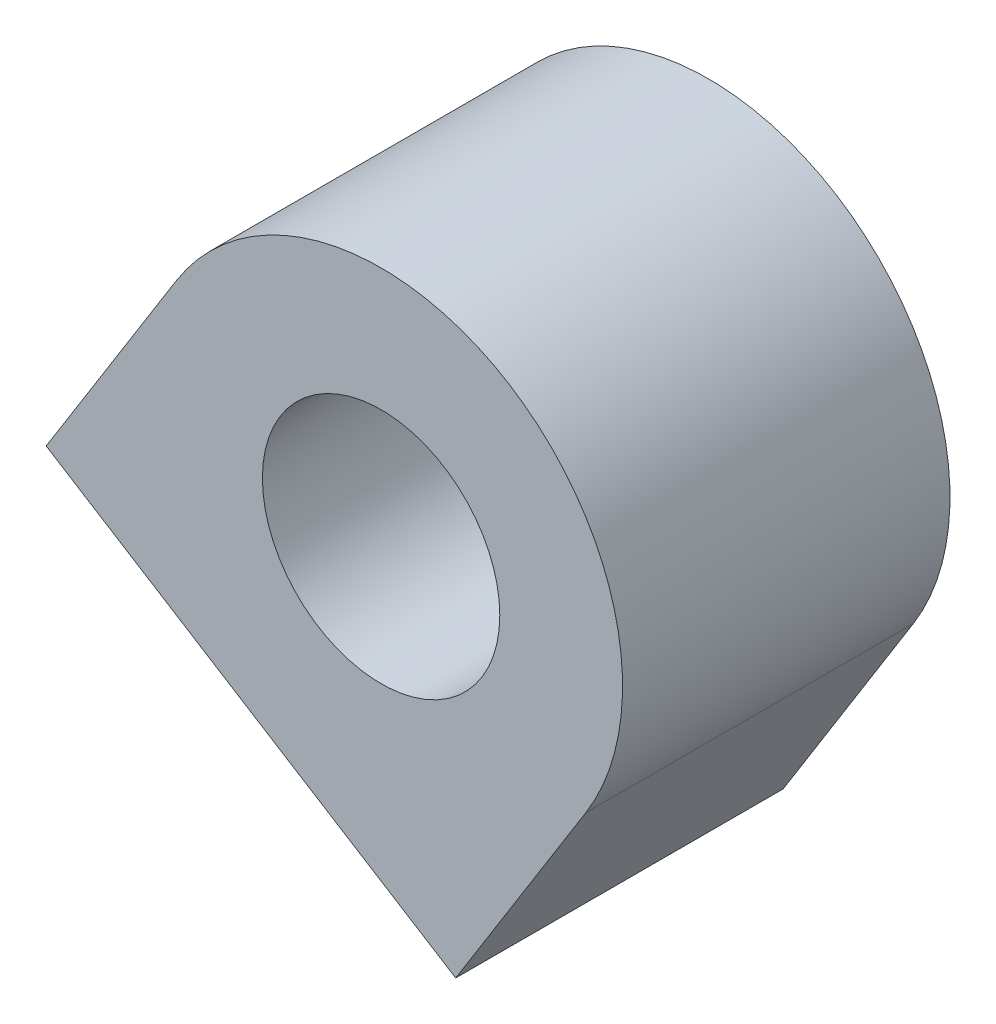
ISO-10303-21;
HEADER;
FILE_DESCRIPTION(('STEP AP214'),'2;1');
FILE_NAME('part.step','',(''),(''),'','','');
FILE_SCHEMA(('AUTOMOTIVE_DESIGN { 1 0 10303 214 1 1 1 1 }'));
ENDSEC;
DATA;
#1=APPLICATION_CONTEXT('core data for automotive mechanical design processes');
#2=APPLICATION_PROTOCOL_DEFINITION('international standard','automotive_design',2000,#1);
#3=PRODUCT_CONTEXT('',#1,'mechanical');
#4=PRODUCT('Part','Part','',(#3));
#5=PRODUCT_RELATED_PRODUCT_CATEGORY('part','',(#4));
#6=PRODUCT_DEFINITION_FORMATION('','',#4);
#7=PRODUCT_DEFINITION_CONTEXT('part definition',#1,'design');
#8=PRODUCT_DEFINITION('design','',#6,#7);
#9=PRODUCT_DEFINITION_SHAPE('','',#8);
#10=(LENGTH_UNIT() NAMED_UNIT(*) SI_UNIT(.MILLI.,.METRE.));
#11=(NAMED_UNIT(*) PLANE_ANGLE_UNIT() SI_UNIT($,.RADIAN.));
#12=(NAMED_UNIT(*) SI_UNIT($,.STERADIAN.) SOLID_ANGLE_UNIT());
#13=UNCERTAINTY_MEASURE_WITH_UNIT(LENGTH_MEASURE(1.E-05),#10,'distance_accuracy_value','');
#14=(GEOMETRIC_REPRESENTATION_CONTEXT(3) GLOBAL_UNCERTAINTY_ASSIGNED_CONTEXT((#13)) GLOBAL_UNIT_ASSIGNED_CONTEXT((#10,
#11,#12)) REPRESENTATION_CONTEXT('',''));
#15=CARTESIAN_POINT('',(0.,0.,0.));
#16=DIRECTION('',(0.,0.,1.));
#17=DIRECTION('',(1.,0.,0.));
#18=AXIS2_PLACEMENT_3D('',#15,#16,#17);
#19=CARTESIAN_POINT('',(0.,0.,5.));
#20=DIRECTION('',(0.,0.,-1.));
#21=DIRECTION('',(-1.,0.,0.));
#22=AXIS2_PLACEMENT_3D('',#19,#20,#21);
#23=PLANE('',#22);
#24=CARTESIAN_POINT('',(-58.1017203304311,-13.2762736974744,5.));
#25=DIRECTION('',(0.,0.,-1.));
#26=DIRECTION('',(-1.,0.,0.));
#27=AXIS2_PLACEMENT_3D('',#24,#25,#26);
#28=CIRCLE('',#27,1.45);
#29=CARTESIAN_POINT('',(-59.5517203304311,-13.2762736974744,5.));
#30=VERTEX_POINT('',#29);
#31=EDGE_CURVE('E89',#30,#30,#28,.T.);
#32=ORIENTED_EDGE('',*,*,#31,.T.);
#33=EDGE_LOOP('',(#32));
#34=FACE_BOUND('',#33,.T.);
#35=DIRECTION('',(-0.52999894000318,-0.847998304005088,0.));
#36=VECTOR('',#35,1.);
#37=CARTESIAN_POINT('',(-38.3157427861253,23.9473392413283,5.));
#38=LINE('',#37,#36);
#39=CARTESIAN_POINT('',(-60.6033153272461,-11.712776824465,5.));
#40=VERTEX_POINT('',#39);
#41=CARTESIAN_POINT('',(-62.1933121472557,-14.2567717364803,5.00000000000001));
#42=VERTEX_POINT('',#41);
#43=EDGE_CURVE('E44',#40,#42,#38,.T.);
#44=ORIENTED_EDGE('',*,*,#43,.T.);
#45=DIRECTION('',(-0.847998304005088,0.52999894000318,0.));
#46=VECTOR('',#45,1.);
#47=CARTESIAN_POINT('',(-23.8775693611304,-38.2041109778086,5.));
#48=LINE('',#47,#46);
#49=CARTESIAN_POINT('',(-57.1901221536256,-17.383765482499,5.));
#50=VERTEX_POINT('',#49);
#51=EDGE_CURVE('E95',#50,#42,#48,.T.);
#52=ORIENTED_EDGE('',*,*,#51,.F.);
#53=DIRECTION('',(-0.529998940003178,-0.847998304005089,0.));
#54=VECTOR('',#53,1.);
#55=CARTESIAN_POINT('',(-33.3125527924954,20.8203454953095,5.));
#56=LINE('',#55,#54);
#57=CARTESIAN_POINT('',(-55.6001253336161,-14.8397705704838,5.));
#58=VERTEX_POINT('',#57);
#59=EDGE_CURVE('E86',#58,#50,#56,.T.);
#60=ORIENTED_EDGE('',*,*,#59,.F.);
#61=CARTESIAN_POINT('',(-58.1017203304311,-13.2762736974744,5.));
#62=DIRECTION('',(0.,0.,-1.));
#63=DIRECTION('',(-1.,0.,0.));
#64=AXIS2_PLACEMENT_3D('',#61,#62,#63);
#65=CIRCLE('',#64,2.95);
#66=EDGE_CURVE('E83',#40,#58,#65,.T.);
#67=ORIENTED_EDGE('',*,*,#66,.F.);
#68=EDGE_LOOP('',(#44,#52,#60,#67));
#69=FACE_BOUND('',#68,.T.);
#70=ADVANCED_FACE('F41',(#34,#69),#23,.F.);
#71=CARTESIAN_POINT('',(-58.1017203304311,-13.2762736974744,1.));
#72=DIRECTION('',(0.,0.,1.));
#73=DIRECTION('',(1.,0.,0.));
#74=AXIS2_PLACEMENT_3D('',#71,#72,#73);
#75=CYLINDRICAL_SURFACE('',#74,2.95);
#76=DIRECTION('',(0.,0.,1.));
#77=VECTOR('',#76,1.);
#78=CARTESIAN_POINT('',(-60.6033153272461,-11.712776824465,1.));
#79=LINE('',#78,#77);
#80=CARTESIAN_POINT('',(-60.6033153272461,-11.712776824465,1.));
#81=VERTEX_POINT('',#80);
#82=EDGE_CURVE('E56',#81,#40,#79,.T.);
#83=ORIENTED_EDGE('',*,*,#82,.T.);
#84=ORIENTED_EDGE('',*,*,#66,.T.);
#85=DIRECTION('',(0.,0.,1.));
#86=VECTOR('',#85,1.);
#87=CARTESIAN_POINT('',(-55.6001253336161,-14.8397705704838,1.));
#88=LINE('',#87,#86);
#89=CARTESIAN_POINT('',(-55.6001253336161,-14.8397705704838,1.));
#90=VERTEX_POINT('',#89);
#91=EDGE_CURVE('E94',#90,#58,#88,.T.);
#92=ORIENTED_EDGE('',*,*,#91,.F.);
#93=CARTESIAN_POINT('',(-58.1017203304311,-13.2762736974744,1.));
#94=DIRECTION('',(0.,0.,-1.));
#95=DIRECTION('',(-1.,0.,0.));
#96=AXIS2_PLACEMENT_3D('',#93,#94,#95);
#97=CIRCLE('',#96,2.95);
#98=EDGE_CURVE('E49',#81,#90,#97,.T.);
#99=ORIENTED_EDGE('',*,*,#98,.F.);
#100=EDGE_LOOP('',(#83,#84,#92,#99));
#101=FACE_BOUND('',#100,.T.);
#102=ADVANCED_FACE('F93',(#101),#75,.T.);
#103=CARTESIAN_POINT('',(0.,0.,1.));
#104=DIRECTION('',(0.,0.,-1.));
#105=DIRECTION('',(-1.,0.,0.));
#106=AXIS2_PLACEMENT_3D('',#103,#104,#105);
#107=PLANE('',#106);
#108=DIRECTION('',(-0.52999894000318,-0.847998304005088,0.));
#109=VECTOR('',#108,1.);
#110=CARTESIAN_POINT('',(-38.3157427861253,23.9473392413283,1.));
#111=LINE('',#110,#109);
#112=CARTESIAN_POINT('',(-62.1933121472557,-14.2567717364803,1.));
#113=VERTEX_POINT('',#112);
#114=EDGE_CURVE('E11',#81,#113,#111,.T.);
#115=ORIENTED_EDGE('',*,*,#114,.F.);
#116=ORIENTED_EDGE('',*,*,#98,.T.);
#117=DIRECTION('',(-0.529998940003179,-0.847998304005089,0.));
#118=VECTOR('',#117,1.);
#119=CARTESIAN_POINT('',(-33.3125527924954,20.8203454953095,1.));
#120=LINE('',#119,#118);
#121=CARTESIAN_POINT('',(-57.1901221536257,-17.383765482499,1.));
#122=VERTEX_POINT('',#121);
#123=EDGE_CURVE('E108',#90,#122,#120,.T.);
#124=ORIENTED_EDGE('',*,*,#123,.T.);
#125=DIRECTION('',(0.847998304005088,-0.52999894000318,0.));
#126=VECTOR('',#125,1.);
#127=CARTESIAN_POINT('',(-23.8775693611304,-38.2041109778086,1.));
#128=LINE('',#127,#126);
#129=EDGE_CURVE('E105',#113,#122,#128,.T.);
#130=ORIENTED_EDGE('',*,*,#129,.F.);
#131=EDGE_LOOP('',(#115,#116,#124,#130));
#132=FACE_BOUND('',#131,.T.);
#133=CARTESIAN_POINT('',(-58.1017203304311,-13.2762736974744,1.));
#134=DIRECTION('',(0.,0.,-1.));
#135=DIRECTION('',(-1.,0.,0.));
#136=AXIS2_PLACEMENT_3D('',#133,#134,#135);
#137=CIRCLE('',#136,1.45);
#138=CARTESIAN_POINT('',(-59.5517203304311,-13.2762736974744,1.));
#139=VERTEX_POINT('',#138);
#140=EDGE_CURVE('E102',#139,#139,#137,.T.);
#141=ORIENTED_EDGE('',*,*,#140,.F.);
#142=EDGE_LOOP('',(#141));
#143=FACE_BOUND('',#142,.T.);
#144=ADVANCED_FACE('F121',(#132,#143),#107,.T.);
#145=CARTESIAN_POINT('',(-38.3157427861253,23.9473392413283,1.));
#146=DIRECTION('',(-0.847998304005088,0.52999894000318,0.));
#147=DIRECTION('',(-0.52999894000318,-0.847998304005088,0.));
#148=AXIS2_PLACEMENT_3D('',#145,#146,#147);
#149=PLANE('',#148);
#150=ORIENTED_EDGE('',*,*,#43,.F.);
#151=ORIENTED_EDGE('',*,*,#82,.F.);
#152=ORIENTED_EDGE('',*,*,#114,.T.);
#153=DIRECTION('',(0.,0.,1.));
#154=VECTOR('',#153,1.);
#155=CARTESIAN_POINT('',(-62.1933121472557,-14.2567717364803,1.));
#156=LINE('',#155,#154);
#157=EDGE_CURVE('E92',#113,#42,#156,.T.);
#158=ORIENTED_EDGE('',*,*,#157,.T.);
#159=EDGE_LOOP('',(#150,#151,#152,#158));
#160=FACE_BOUND('',#159,.T.);
#161=ADVANCED_FACE('F91',(#160),#149,.T.);
#162=CARTESIAN_POINT('',(-33.3125527924954,20.8203454953095,1.));
#163=DIRECTION('',(-0.847998304005089,0.529998940003178,0.));
#164=DIRECTION('',(-0.529998940003178,-0.847998304005089,0.));
#165=AXIS2_PLACEMENT_3D('',#162,#163,#164);
#166=PLANE('',#165);
#167=ORIENTED_EDGE('',*,*,#91,.T.);
#168=ORIENTED_EDGE('',*,*,#59,.T.);
#169=DIRECTION('',(0.,0.,1.));
#170=VECTOR('',#169,1.);
#171=CARTESIAN_POINT('',(-57.1901221536257,-17.383765482499,1.));
#172=LINE('',#171,#170);
#173=EDGE_CURVE('E97',#122,#50,#172,.T.);
#174=ORIENTED_EDGE('',*,*,#173,.F.);
#175=ORIENTED_EDGE('',*,*,#123,.F.);
#176=EDGE_LOOP('',(#167,#168,#174,#175));
#177=FACE_BOUND('',#176,.T.);
#178=ADVANCED_FACE('F127',(#177),#166,.F.);
#179=CARTESIAN_POINT('',(-23.8775693611304,-38.2041109778086,1.));
#180=DIRECTION('',(-0.52999894000318,-0.847998304005088,0.));
#181=DIRECTION('',(0.847998304005088,-0.52999894000318,0.));
#182=AXIS2_PLACEMENT_3D('',#179,#180,#181);
#183=PLANE('',#182);
#184=ORIENTED_EDGE('',*,*,#173,.T.);
#185=ORIENTED_EDGE('',*,*,#51,.T.);
#186=ORIENTED_EDGE('',*,*,#157,.F.);
#187=ORIENTED_EDGE('',*,*,#129,.T.);
#188=EDGE_LOOP('',(#184,#185,#186,#187));
#189=FACE_BOUND('',#188,.T.);
#190=ADVANCED_FACE('F117',(#189),#183,.T.);
#191=CARTESIAN_POINT('',(-58.1017203304311,-13.2762736974744,1.));
#192=DIRECTION('',(0.,0.,1.));
#193=DIRECTION('',(1.,0.,0.));
#194=AXIS2_PLACEMENT_3D('',#191,#192,#193);
#195=CYLINDRICAL_SURFACE('',#194,1.45);
#196=ORIENTED_EDGE('',*,*,#31,.F.);
#197=EDGE_LOOP('',(#196));
#198=FACE_BOUND('',#197,.T.);
#199=ORIENTED_EDGE('',*,*,#140,.T.);
#200=EDGE_LOOP('',(#199));
#201=FACE_BOUND('',#200,.T.);
#202=ADVANCED_FACE('F114',(#198,#201),#195,.F.);
#203=CLOSED_SHELL('',(#70,#102,#144,#161,#178,#190,#202));
#204=MANIFOLD_SOLID_BREP('B2',#203);
#205=ADVANCED_BREP_SHAPE_REPRESENTATION('',(#18,#204),#14);
#206=SHAPE_DEFINITION_REPRESENTATION(#9,#205);
ENDSEC;
END-ISO-10303-21;
